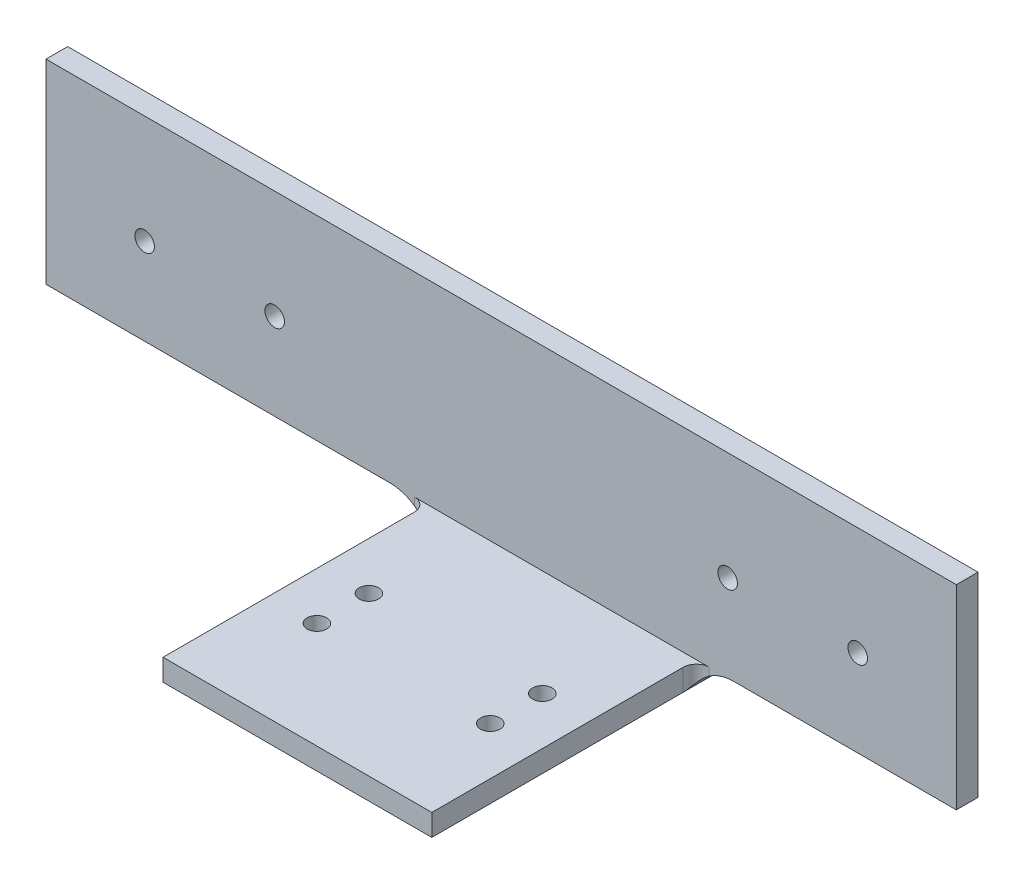
ISO-10303-21;
HEADER;
FILE_DESCRIPTION(('STEP AP214'),'2;1');
FILE_NAME('part.step','',(''),(''),'','','');
FILE_SCHEMA(('AUTOMOTIVE_DESIGN { 1 0 10303 214 1 1 1 1 }'));
ENDSEC;
DATA;
#1=APPLICATION_CONTEXT('core data for automotive mechanical design processes');
#2=APPLICATION_PROTOCOL_DEFINITION('international standard','automotive_design',2000,#1);
#3=PRODUCT_CONTEXT('',#1,'mechanical');
#4=PRODUCT('Part','Part','',(#3));
#5=PRODUCT_RELATED_PRODUCT_CATEGORY('part','',(#4));
#6=PRODUCT_DEFINITION_FORMATION('','',#4);
#7=PRODUCT_DEFINITION_CONTEXT('part definition',#1,'design');
#8=PRODUCT_DEFINITION('design','',#6,#7);
#9=PRODUCT_DEFINITION_SHAPE('','',#8);
#10=(LENGTH_UNIT() NAMED_UNIT(*) SI_UNIT(.MILLI.,.METRE.));
#11=(NAMED_UNIT(*) PLANE_ANGLE_UNIT() SI_UNIT($,.RADIAN.));
#12=(NAMED_UNIT(*) SI_UNIT($,.STERADIAN.) SOLID_ANGLE_UNIT());
#13=UNCERTAINTY_MEASURE_WITH_UNIT(LENGTH_MEASURE(1.E-05),#10,'distance_accuracy_value','');
#14=(GEOMETRIC_REPRESENTATION_CONTEXT(3) GLOBAL_UNCERTAINTY_ASSIGNED_CONTEXT((#13)) GLOBAL_UNIT_ASSIGNED_CONTEXT((#10,
#11,#12)) REPRESENTATION_CONTEXT('',''));
#15=CARTESIAN_POINT('',(0.,0.,0.));
#16=DIRECTION('',(0.,0.,1.));
#17=DIRECTION('',(1.,0.,0.));
#18=AXIS2_PLACEMENT_3D('',#15,#16,#17);
#19=CARTESIAN_POINT('',(0.,0.,0.));
#20=DIRECTION('',(0.,0.,-1.));
#21=DIRECTION('',(-1.,0.,0.));
#22=AXIS2_PLACEMENT_3D('',#19,#20,#21);
#23=PLANE('',#22);
#24=CARTESIAN_POINT('',(52.75,25.0000000000001,0.));
#25=DIRECTION('',(0.,0.,-1.));
#26=DIRECTION('',(-1.,0.,0.));
#27=AXIS2_PLACEMENT_3D('',#24,#25,#26);
#28=CIRCLE('',#27,2.25000000000001);
#29=CARTESIAN_POINT('',(50.4999999999999,25.0000000000001,0.));
#30=VERTEX_POINT('',#29);
#31=EDGE_CURVE('E275',#30,#30,#28,.T.);
#32=ORIENTED_EDGE('',*,*,#31,.F.);
#33=EDGE_LOOP('',(#32));
#34=FACE_BOUND('',#33,.T.);
#35=CARTESIAN_POINT('',(157.25,25.,0.));
#36=DIRECTION('',(0.,0.,1.));
#37=DIRECTION('',(1.,0.,0.));
#38=AXIS2_PLACEMENT_3D('',#35,#36,#37);
#39=CIRCLE('',#38,2.25000000000001);
#40=CARTESIAN_POINT('',(159.5,25.,0.));
#41=VERTEX_POINT('',#40);
#42=EDGE_CURVE('E281',#41,#41,#39,.T.);
#43=ORIENTED_EDGE('',*,*,#42,.T.);
#44=EDGE_LOOP('',(#43));
#45=FACE_BOUND('',#44,.T.);
#46=CARTESIAN_POINT('',(187.25,25.,0.));
#47=DIRECTION('',(0.,0.,1.));
#48=DIRECTION('',(1.,0.,0.));
#49=AXIS2_PLACEMENT_3D('',#46,#47,#48);
#50=CIRCLE('',#49,2.25000000000001);
#51=CARTESIAN_POINT('',(189.5,25.,0.));
#52=VERTEX_POINT('',#51);
#53=EDGE_CURVE('E262',#52,#52,#50,.T.);
#54=ORIENTED_EDGE('',*,*,#53,.T.);
#55=EDGE_LOOP('',(#54));
#56=FACE_BOUND('',#55,.T.);
#57=CARTESIAN_POINT('',(22.75,25.0000000000002,0.));
#58=DIRECTION('',(0.,0.,-1.));
#59=DIRECTION('',(-1.,0.,0.));
#60=AXIS2_PLACEMENT_3D('',#57,#58,#59);
#61=CIRCLE('',#60,2.25000000000001);
#62=CARTESIAN_POINT('',(20.5,25.0000000000002,0.));
#63=VERTEX_POINT('',#62);
#64=EDGE_CURVE('E265',#63,#63,#61,.T.);
#65=ORIENTED_EDGE('',*,*,#64,.F.);
#66=EDGE_LOOP('',(#65));
#67=FACE_BOUND('',#66,.T.);
#68=DIRECTION('',(1.,0.,0.));
#69=VECTOR('',#68,1.);
#70=CARTESIAN_POINT('',(0.,0.,0.));
#71=LINE('',#70,#69);
#72=CARTESIAN_POINT('',(88.,0.,0.));
#73=VERTEX_POINT('',#72);
#74=CARTESIAN_POINT('',(150.,0.,0.));
#75=VERTEX_POINT('',#74);
#76=EDGE_CURVE('E219',#73,#75,#71,.T.);
#77=ORIENTED_EDGE('',*,*,#76,.F.);
#78=CARTESIAN_POINT('',(79.3397459621556,-5.00000000000002,0.));
#79=DIRECTION('',(0.,0.,-1.));
#80=DIRECTION('',(-1.,0.,0.));
#81=AXIS2_PLACEMENT_3D('',#78,#79,#80);
#82=CIRCLE('',#81,10.);
#83=CARTESIAN_POINT('',(79.3397459621556,4.99999999999998,0.));
#84=VERTEX_POINT('',#83);
#85=EDGE_CURVE('E123',#73,#84,#82,.F.);
#86=ORIENTED_EDGE('',*,*,#85,.T.);
#87=DIRECTION('',(-1.,0.,0.));
#88=VECTOR('',#87,1.);
#89=CARTESIAN_POINT('',(0.,4.99999999999997,0.));
#90=LINE('',#89,#88);
#91=CARTESIAN_POINT('',(0.,4.99999999999997,0.));
#92=VERTEX_POINT('',#91);
#93=EDGE_CURVE('E216',#84,#92,#90,.T.);
#94=ORIENTED_EDGE('',*,*,#93,.T.);
#95=DIRECTION('',(0.,-1.,0.));
#96=VECTOR('',#95,1.);
#97=CARTESIAN_POINT('',(0.,0.,0.));
#98=LINE('',#97,#96);
#99=CARTESIAN_POINT('',(0.,50.,0.));
#100=VERTEX_POINT('',#99);
#101=EDGE_CURVE('E268',#100,#92,#98,.T.);
#102=ORIENTED_EDGE('',*,*,#101,.F.);
#103=DIRECTION('',(-1.,0.,0.));
#104=VECTOR('',#103,1.);
#105=CARTESIAN_POINT('',(0.,50.,0.));
#106=LINE('',#105,#104);
#107=CARTESIAN_POINT('',(210.,50.,0.));
#108=VERTEX_POINT('',#107);
#109=EDGE_CURVE('E292',#108,#100,#106,.T.);
#110=ORIENTED_EDGE('',*,*,#109,.F.);
#111=DIRECTION('',(0.,1.,0.));
#112=VECTOR('',#111,1.);
#113=CARTESIAN_POINT('',(210.,0.,0.));
#114=LINE('',#113,#112);
#115=CARTESIAN_POINT('',(210.,5.,0.));
#116=VERTEX_POINT('',#115);
#117=EDGE_CURVE('E301',#116,#108,#114,.T.);
#118=ORIENTED_EDGE('',*,*,#117,.F.);
#119=DIRECTION('',(-1.,0.,0.));
#120=VECTOR('',#119,1.);
#121=CARTESIAN_POINT('',(210.,5.,0.));
#122=LINE('',#121,#120);
#123=CARTESIAN_POINT('',(158.660254037844,4.99999999999999,0.));
#124=VERTEX_POINT('',#123);
#125=EDGE_CURVE('E110',#116,#124,#122,.T.);
#126=ORIENTED_EDGE('',*,*,#125,.T.);
#127=CARTESIAN_POINT('',(158.660254037844,-5.00000000000001,0.));
#128=DIRECTION('',(0.,0.,-1.));
#129=DIRECTION('',(-1.,0.,0.));
#130=AXIS2_PLACEMENT_3D('',#127,#128,#129);
#131=CIRCLE('',#130,10.);
#132=EDGE_CURVE('E192',#124,#75,#131,.F.);
#133=ORIENTED_EDGE('',*,*,#132,.T.);
#134=EDGE_LOOP('',(#77,#86,#94,#102,#110,#118,#126,#133));
#135=FACE_BOUND('',#134,.T.);
#136=ADVANCED_FACE('F37',(#34,#45,#56,#67,#135),#23,.T.);
#137=CARTESIAN_POINT('',(0.,0.,5.));
#138=DIRECTION('',(0.,1.,0.));
#139=DIRECTION('',(0.,0.,1.));
#140=AXIS2_PLACEMENT_3D('',#137,#138,#139);
#141=PLANE('',#140);
#142=CARTESIAN_POINT('',(138.991167508963,0.,29.5));
#143=DIRECTION('',(0.,1.,0.));
#144=DIRECTION('',(0.,0.,1.));
#145=AXIS2_PLACEMENT_3D('',#142,#143,#144);
#146=CIRCLE('',#145,2.25000000000001);
#147=CARTESIAN_POINT('',(138.991167508963,0.,31.75));
#148=VERTEX_POINT('',#147);
#149=EDGE_CURVE('E343',#148,#148,#146,.T.);
#150=ORIENTED_EDGE('',*,*,#149,.T.);
#151=EDGE_LOOP('',(#150));
#152=FACE_BOUND('',#151,.T.);
#153=CARTESIAN_POINT('',(98.9911675089627,0.,41.5));
#154=DIRECTION('',(0.,1.,0.));
#155=DIRECTION('',(0.,0.,1.));
#156=AXIS2_PLACEMENT_3D('',#153,#154,#155);
#157=CIRCLE('',#156,2.25);
#158=CARTESIAN_POINT('',(98.9911675089627,0.,43.75));
#159=VERTEX_POINT('',#158);
#160=EDGE_CURVE('E345',#159,#159,#157,.T.);
#161=ORIENTED_EDGE('',*,*,#160,.T.);
#162=EDGE_LOOP('',(#161));
#163=FACE_BOUND('',#162,.T.);
#164=CARTESIAN_POINT('',(138.991167508963,0.,41.5));
#165=DIRECTION('',(0.,1.,0.));
#166=DIRECTION('',(0.,0.,1.));
#167=AXIS2_PLACEMENT_3D('',#164,#165,#166);
#168=CIRCLE('',#167,2.25000000000001);
#169=CARTESIAN_POINT('',(138.991167508963,0.,43.75));
#170=VERTEX_POINT('',#169);
#171=EDGE_CURVE('E348',#170,#170,#168,.T.);
#172=ORIENTED_EDGE('',*,*,#171,.T.);
#173=EDGE_LOOP('',(#172));
#174=FACE_BOUND('',#173,.T.);
#175=CARTESIAN_POINT('',(98.9911675089627,0.,29.5));
#176=DIRECTION('',(0.,1.,0.));
#177=DIRECTION('',(0.,0.,1.));
#178=AXIS2_PLACEMENT_3D('',#175,#176,#177);
#179=CIRCLE('',#178,2.25);
#180=CARTESIAN_POINT('',(98.9911675089627,0.,31.75));
#181=VERTEX_POINT('',#180);
#182=EDGE_CURVE('E353',#181,#181,#179,.T.);
#183=ORIENTED_EDGE('',*,*,#182,.T.);
#184=EDGE_LOOP('',(#183));
#185=FACE_BOUND('',#184,.T.);
#186=DIRECTION('',(0.,0.,1.));
#187=VECTOR('',#186,1.);
#188=CARTESIAN_POINT('',(88.,0.,-0.001000000000001));
#189=LINE('',#188,#187);
#190=CARTESIAN_POINT('',(88.,0.,8.));
#191=VERTEX_POINT('',#190);
#192=EDGE_CURVE('E80',#73,#191,#189,.T.);
#193=ORIENTED_EDGE('',*,*,#192,.F.);
#194=ORIENTED_EDGE('',*,*,#76,.T.);
#195=DIRECTION('',(0.,0.,1.));
#196=VECTOR('',#195,1.);
#197=CARTESIAN_POINT('',(150.,0.,-0.001000000000001));
#198=LINE('',#197,#196);
#199=CARTESIAN_POINT('',(150.,0.,8.));
#200=VERTEX_POINT('',#199);
#201=EDGE_CURVE('E58',#75,#200,#198,.T.);
#202=ORIENTED_EDGE('',*,*,#201,.T.);
#203=CARTESIAN_POINT('',(150.,0.,66.));
#204=VERTEX_POINT('',#203);
#205=EDGE_CURVE('E254',#200,#204,#198,.T.);
#206=ORIENTED_EDGE('',*,*,#205,.T.);
#207=DIRECTION('',(1.,0.,0.));
#208=VECTOR('',#207,1.);
#209=CARTESIAN_POINT('',(210.,0.,66.));
#210=LINE('',#209,#208);
#211=CARTESIAN_POINT('',(88.,0.,66.));
#212=VERTEX_POINT('',#211);
#213=EDGE_CURVE('E240',#212,#204,#210,.T.);
#214=ORIENTED_EDGE('',*,*,#213,.F.);
#215=EDGE_CURVE('E235',#191,#212,#189,.T.);
#216=ORIENTED_EDGE('',*,*,#215,.F.);
#217=EDGE_LOOP('',(#193,#194,#202,#206,#214,#216));
#218=FACE_BOUND('',#217,.T.);
#219=ADVANCED_FACE('F148',(#152,#163,#174,#185,#218),#141,.F.);
#220=CARTESIAN_POINT('',(210.,5.,66.));
#221=DIRECTION('',(0.,-1.,0.));
#222=DIRECTION('',(1.,0.,0.));
#223=AXIS2_PLACEMENT_3D('',#220,#221,#222);
#224=PLANE('',#223);
#225=CARTESIAN_POINT('',(138.991167508963,4.99999999999999,29.5));
#226=DIRECTION('',(0.,1.,0.));
#227=DIRECTION('',(-1.,0.,0.));
#228=AXIS2_PLACEMENT_3D('',#225,#226,#227);
#229=CIRCLE('',#228,2.25000000000001);
#230=CARTESIAN_POINT('',(136.741167508963,4.99999999999999,29.5));
#231=VERTEX_POINT('',#230);
#232=EDGE_CURVE('E359',#231,#231,#229,.T.);
#233=ORIENTED_EDGE('',*,*,#232,.F.);
#234=EDGE_LOOP('',(#233));
#235=FACE_BOUND('',#234,.T.);
#236=CARTESIAN_POINT('',(98.9911675089627,4.99999999999998,41.5));
#237=DIRECTION('',(0.,1.,0.));
#238=DIRECTION('',(-1.,0.,0.));
#239=AXIS2_PLACEMENT_3D('',#236,#237,#238);
#240=CIRCLE('',#239,2.25);
#241=CARTESIAN_POINT('',(96.7411675089627,4.99999999999998,41.5));
#242=VERTEX_POINT('',#241);
#243=EDGE_CURVE('E360',#242,#242,#240,.T.);
#244=ORIENTED_EDGE('',*,*,#243,.F.);
#245=EDGE_LOOP('',(#244));
#246=FACE_BOUND('',#245,.T.);
#247=CARTESIAN_POINT('',(138.991167508963,4.99999999999999,41.5));
#248=DIRECTION('',(0.,1.,0.));
#249=DIRECTION('',(-1.,0.,0.));
#250=AXIS2_PLACEMENT_3D('',#247,#248,#249);
#251=CIRCLE('',#250,2.25000000000001);
#252=CARTESIAN_POINT('',(136.741167508963,4.99999999999999,41.5));
#253=VERTEX_POINT('',#252);
#254=EDGE_CURVE('E363',#253,#253,#251,.T.);
#255=ORIENTED_EDGE('',*,*,#254,.F.);
#256=EDGE_LOOP('',(#255));
#257=FACE_BOUND('',#256,.T.);
#258=CARTESIAN_POINT('',(98.9911675089627,4.99999999999998,29.5));
#259=DIRECTION('',(0.,1.,0.));
#260=DIRECTION('',(-1.,0.,0.));
#261=AXIS2_PLACEMENT_3D('',#258,#259,#260);
#262=CIRCLE('',#261,2.25);
#263=CARTESIAN_POINT('',(96.7411675089627,4.99999999999998,29.5));
#264=VERTEX_POINT('',#263);
#265=EDGE_CURVE('E356',#264,#264,#262,.T.);
#266=ORIENTED_EDGE('',*,*,#265,.F.);
#267=EDGE_LOOP('',(#266));
#268=FACE_BOUND('',#267,.T.);
#269=DIRECTION('',(-1.,0.,0.));
#270=VECTOR('',#269,1.);
#271=CARTESIAN_POINT('',(210.,5.,5.));
#272=LINE('',#271,#270);
#273=CARTESIAN_POINT('',(153.,4.99999999999999,5.));
#274=VERTEX_POINT('',#273);
#275=CARTESIAN_POINT('',(85.,4.99999999999998,5.));
#276=VERTEX_POINT('',#275);
#277=EDGE_CURVE('E101',#274,#276,#272,.T.);
#278=ORIENTED_EDGE('',*,*,#277,.T.);
#279=CARTESIAN_POINT('',(85.,4.99999999999998,8.));
#280=DIRECTION('',(0.,-1.,0.));
#281=DIRECTION('',(1.,0.,0.));
#282=AXIS2_PLACEMENT_3D('',#279,#280,#281);
#283=CIRCLE('',#282,3.);
#284=CARTESIAN_POINT('',(88.,4.99999999999998,8.));
#285=VERTEX_POINT('',#284);
#286=EDGE_CURVE('E90',#276,#285,#283,.T.);
#287=ORIENTED_EDGE('',*,*,#286,.T.);
#288=DIRECTION('',(0.,0.,1.));
#289=VECTOR('',#288,1.);
#290=CARTESIAN_POINT('',(88.,4.99999999999998,-0.001000000000001));
#291=LINE('',#290,#289);
#292=CARTESIAN_POINT('',(88.,4.99999999999998,66.));
#293=VERTEX_POINT('',#292);
#294=EDGE_CURVE('E237',#285,#293,#291,.T.);
#295=ORIENTED_EDGE('',*,*,#294,.T.);
#296=DIRECTION('',(-1.,0.,0.));
#297=VECTOR('',#296,1.);
#298=CARTESIAN_POINT('',(210.,5.,66.));
#299=LINE('',#298,#297);
#300=CARTESIAN_POINT('',(150.,4.99999999999999,66.));
#301=VERTEX_POINT('',#300);
#302=EDGE_CURVE('E259',#301,#293,#299,.T.);
#303=ORIENTED_EDGE('',*,*,#302,.F.);
#304=DIRECTION('',(0.,0.,1.));
#305=VECTOR('',#304,1.);
#306=CARTESIAN_POINT('',(150.,4.99999999999999,-0.001000000000001));
#307=LINE('',#306,#305);
#308=CARTESIAN_POINT('',(150.,4.99999999999999,8.));
#309=VERTEX_POINT('',#308);
#310=EDGE_CURVE('E116',#309,#301,#307,.T.);
#311=ORIENTED_EDGE('',*,*,#310,.F.);
#312=CARTESIAN_POINT('',(153.,4.99999999999999,8.));
#313=DIRECTION('',(0.,-1.,0.));
#314=DIRECTION('',(1.,0.,0.));
#315=AXIS2_PLACEMENT_3D('',#312,#313,#314);
#316=CIRCLE('',#315,3.);
#317=EDGE_CURVE('E51',#309,#274,#316,.T.);
#318=ORIENTED_EDGE('',*,*,#317,.T.);
#319=EDGE_LOOP('',(#278,#287,#295,#303,#311,#318));
#320=FACE_BOUND('',#319,.T.);
#321=ADVANCED_FACE('F113',(#235,#246,#257,#268,#320),#224,.F.);
#322=CARTESIAN_POINT('',(0.,0.,66.));
#323=DIRECTION('',(0.,0.,1.));
#324=DIRECTION('',(1.,0.,0.));
#325=AXIS2_PLACEMENT_3D('',#322,#323,#324);
#326=PLANE('',#325);
#327=ORIENTED_EDGE('',*,*,#302,.T.);
#328=DIRECTION('',(0.,-1.,0.));
#329=VECTOR('',#328,1.);
#330=CARTESIAN_POINT('',(88.,0.,66.));
#331=LINE('',#330,#329);
#332=EDGE_CURVE('E244',#293,#212,#331,.T.);
#333=ORIENTED_EDGE('',*,*,#332,.T.);
#334=ORIENTED_EDGE('',*,*,#213,.T.);
#335=DIRECTION('',(0.,-1.,0.));
#336=VECTOR('',#335,1.);
#337=CARTESIAN_POINT('',(150.,4.99999999999999,66.));
#338=LINE('',#337,#336);
#339=EDGE_CURVE('E249',#301,#204,#338,.T.);
#340=ORIENTED_EDGE('',*,*,#339,.F.);
#341=EDGE_LOOP('',(#327,#333,#334,#340));
#342=FACE_BOUND('',#341,.T.);
#343=ADVANCED_FACE('F341',(#342),#326,.T.);
#344=CARTESIAN_POINT('',(0.,0.,5.));
#345=DIRECTION('',(0.,0.,-1.));
#346=DIRECTION('',(-1.,0.,0.));
#347=AXIS2_PLACEMENT_3D('',#344,#345,#346);
#348=PLANE('',#347);
#349=CARTESIAN_POINT('',(22.75,25.0000000000002,5.));
#350=DIRECTION('',(0.,0.,-1.));
#351=DIRECTION('',(-1.,0.,0.));
#352=AXIS2_PLACEMENT_3D('',#349,#350,#351);
#353=CIRCLE('',#352,2.25000000000001);
#354=CARTESIAN_POINT('',(20.5,25.0000000000002,5.));
#355=VERTEX_POINT('',#354);
#356=EDGE_CURVE('E269',#355,#355,#353,.T.);
#357=ORIENTED_EDGE('',*,*,#356,.T.);
#358=EDGE_LOOP('',(#357));
#359=FACE_BOUND('',#358,.T.);
#360=CARTESIAN_POINT('',(52.75,25.0000000000001,5.));
#361=DIRECTION('',(0.,0.,-1.));
#362=DIRECTION('',(-1.,0.,0.));
#363=AXIS2_PLACEMENT_3D('',#360,#361,#362);
#364=CIRCLE('',#363,2.25000000000001);
#365=CARTESIAN_POINT('',(50.4999999999999,25.0000000000001,5.));
#366=VERTEX_POINT('',#365);
#367=EDGE_CURVE('E272',#366,#366,#364,.T.);
#368=ORIENTED_EDGE('',*,*,#367,.T.);
#369=EDGE_LOOP('',(#368));
#370=FACE_BOUND('',#369,.T.);
#371=CARTESIAN_POINT('',(187.25,25.,5.));
#372=DIRECTION('',(0.,0.,1.));
#373=DIRECTION('',(1.,0.,0.));
#374=AXIS2_PLACEMENT_3D('',#371,#372,#373);
#375=CIRCLE('',#374,2.25000000000001);
#376=CARTESIAN_POINT('',(189.5,25.,5.));
#377=VERTEX_POINT('',#376);
#378=EDGE_CURVE('E284',#377,#377,#375,.T.);
#379=ORIENTED_EDGE('',*,*,#378,.F.);
#380=EDGE_LOOP('',(#379));
#381=FACE_BOUND('',#380,.T.);
#382=CARTESIAN_POINT('',(157.25,25.,5.));
#383=DIRECTION('',(0.,0.,1.));
#384=DIRECTION('',(1.,0.,0.));
#385=AXIS2_PLACEMENT_3D('',#382,#383,#384);
#386=CIRCLE('',#385,2.25000000000001);
#387=CARTESIAN_POINT('',(159.5,25.,5.));
#388=VERTEX_POINT('',#387);
#389=EDGE_CURVE('E278',#388,#388,#386,.T.);
#390=ORIENTED_EDGE('',*,*,#389,.F.);
#391=EDGE_LOOP('',(#390));
#392=FACE_BOUND('',#391,.T.);
#393=CARTESIAN_POINT('',(79.3397459621556,-5.00000000000002,5.));
#394=DIRECTION('',(0.,0.,-1.));
#395=DIRECTION('',(-1.,0.,0.));
#396=AXIS2_PLACEMENT_3D('',#393,#394,#395);
#397=CIRCLE('',#396,10.);
#398=CARTESIAN_POINT('',(79.3397459621556,4.99999999999998,5.));
#399=VERTEX_POINT('',#398);
#400=CARTESIAN_POINT('',(85.,3.24387798472698,5.));
#401=VERTEX_POINT('',#400);
#402=EDGE_CURVE('E206',#399,#401,#397,.T.);
#403=ORIENTED_EDGE('',*,*,#402,.T.);
#404=DIRECTION('',(0.,-1.,0.));
#405=VECTOR('',#404,1.);
#406=CARTESIAN_POINT('',(85.,0.,5.));
#407=LINE('',#406,#405);
#408=EDGE_CURVE('E108',#401,#276,#407,.F.);
#409=ORIENTED_EDGE('',*,*,#408,.T.);
#410=ORIENTED_EDGE('',*,*,#277,.F.);
#411=DIRECTION('',(0.,1.,0.));
#412=VECTOR('',#411,1.);
#413=CARTESIAN_POINT('',(153.,0.,5.));
#414=LINE('',#413,#412);
#415=CARTESIAN_POINT('',(153.,3.24387798472699,5.));
#416=VERTEX_POINT('',#415);
#417=EDGE_CURVE('E105',#274,#416,#414,.F.);
#418=ORIENTED_EDGE('',*,*,#417,.T.);
#419=CARTESIAN_POINT('',(158.660254037844,-5.00000000000001,5.));
#420=DIRECTION('',(0.,0.,-1.));
#421=DIRECTION('',(-1.,0.,0.));
#422=AXIS2_PLACEMENT_3D('',#419,#420,#421);
#423=CIRCLE('',#422,10.);
#424=CARTESIAN_POINT('',(158.660254037844,4.99999999999999,5.));
#425=VERTEX_POINT('',#424);
#426=EDGE_CURVE('E203',#416,#425,#423,.T.);
#427=ORIENTED_EDGE('',*,*,#426,.T.);
#428=CARTESIAN_POINT('',(210.,5.,5.));
#429=VERTEX_POINT('',#428);
#430=EDGE_CURVE('E109',#429,#425,#272,.T.);
#431=ORIENTED_EDGE('',*,*,#430,.F.);
#432=DIRECTION('',(0.,1.,0.));
#433=VECTOR('',#432,1.);
#434=CARTESIAN_POINT('',(210.,0.,5.));
#435=LINE('',#434,#433);
#436=CARTESIAN_POINT('',(210.,50.,5.));
#437=VERTEX_POINT('',#436);
#438=EDGE_CURVE('E291',#429,#437,#435,.T.);
#439=ORIENTED_EDGE('',*,*,#438,.T.);
#440=DIRECTION('',(-1.,0.,0.));
#441=VECTOR('',#440,1.);
#442=CARTESIAN_POINT('',(0.,50.,5.));
#443=LINE('',#442,#441);
#444=CARTESIAN_POINT('',(0.,50.,5.));
#445=VERTEX_POINT('',#444);
#446=EDGE_CURVE('E295',#437,#445,#443,.T.);
#447=ORIENTED_EDGE('',*,*,#446,.T.);
#448=DIRECTION('',(0.,-1.,0.));
#449=VECTOR('',#448,1.);
#450=CARTESIAN_POINT('',(0.,0.,5.));
#451=LINE('',#450,#449);
#452=CARTESIAN_POINT('',(0.,4.99999999999997,5.));
#453=VERTEX_POINT('',#452);
#454=EDGE_CURVE('E289',#445,#453,#451,.T.);
#455=ORIENTED_EDGE('',*,*,#454,.T.);
#456=DIRECTION('',(1.,0.,0.));
#457=VECTOR('',#456,1.);
#458=CARTESIAN_POINT('',(0.,4.99999999999997,5.));
#459=LINE('',#458,#457);
#460=EDGE_CURVE('E227',#453,#399,#459,.T.);
#461=ORIENTED_EDGE('',*,*,#460,.T.);
#462=EDGE_LOOP('',(#403,#409,#410,#418,#427,#431,#439,#447,#455,#461));
#463=FACE_BOUND('',#462,.T.);
#464=ADVANCED_FACE('F103',(#359,#370,#381,#392,#463),#348,.F.);
#465=CARTESIAN_POINT('',(0.,0.,5.));
#466=DIRECTION('',(1.,0.,0.));
#467=DIRECTION('',(0.,0.,-1.));
#468=AXIS2_PLACEMENT_3D('',#465,#466,#467);
#469=PLANE('',#468);
#470=ORIENTED_EDGE('',*,*,#101,.T.);
#471=DIRECTION('',(0.,0.,1.));
#472=VECTOR('',#471,1.);
#473=CARTESIAN_POINT('',(0.,4.99999999999997,-0.001000000000001));
#474=LINE('',#473,#472);
#475=EDGE_CURVE('E225',#92,#453,#474,.T.);
#476=ORIENTED_EDGE('',*,*,#475,.T.);
#477=ORIENTED_EDGE('',*,*,#454,.F.);
#478=DIRECTION('',(0.,0.,-1.));
#479=VECTOR('',#478,1.);
#480=CARTESIAN_POINT('',(0.,50.,5.));
#481=LINE('',#480,#479);
#482=EDGE_CURVE('E298',#445,#100,#481,.T.);
#483=ORIENTED_EDGE('',*,*,#482,.T.);
#484=EDGE_LOOP('',(#470,#476,#477,#483));
#485=FACE_BOUND('',#484,.T.);
#486=ADVANCED_FACE('F168',(#485),#469,.F.);
#487=CARTESIAN_POINT('',(210.,0.,5.));
#488=DIRECTION('',(-1.,0.,0.));
#489=DIRECTION('',(0.,0.,1.));
#490=AXIS2_PLACEMENT_3D('',#487,#488,#489);
#491=PLANE('',#490);
#492=ORIENTED_EDGE('',*,*,#438,.F.);
#493=DIRECTION('',(0.,0.,1.));
#494=VECTOR('',#493,1.);
#495=CARTESIAN_POINT('',(210.,5.,-0.001000000000001));
#496=LINE('',#495,#494);
#497=EDGE_CURVE('E252',#116,#429,#496,.T.);
#498=ORIENTED_EDGE('',*,*,#497,.F.);
#499=ORIENTED_EDGE('',*,*,#117,.T.);
#500=DIRECTION('',(0.,0.,-1.));
#501=VECTOR('',#500,1.);
#502=CARTESIAN_POINT('',(210.,50.,5.));
#503=LINE('',#502,#501);
#504=EDGE_CURVE('E308',#437,#108,#503,.T.);
#505=ORIENTED_EDGE('',*,*,#504,.F.);
#506=EDGE_LOOP('',(#492,#498,#499,#505));
#507=FACE_BOUND('',#506,.T.);
#508=ADVANCED_FACE('F165',(#507),#491,.F.);
#509=CARTESIAN_POINT('',(0.,50.,5.));
#510=DIRECTION('',(0.,-1.,0.));
#511=DIRECTION('',(0.,0.,-1.));
#512=AXIS2_PLACEMENT_3D('',#509,#510,#511);
#513=PLANE('',#512);
#514=ORIENTED_EDGE('',*,*,#109,.T.);
#515=ORIENTED_EDGE('',*,*,#482,.F.);
#516=ORIENTED_EDGE('',*,*,#446,.F.);
#517=ORIENTED_EDGE('',*,*,#504,.T.);
#518=EDGE_LOOP('',(#514,#515,#516,#517));
#519=FACE_BOUND('',#518,.T.);
#520=ADVANCED_FACE('F161',(#519),#513,.F.);
#521=CARTESIAN_POINT('',(187.25,25.,0.));
#522=DIRECTION('',(0.,0.,1.));
#523=DIRECTION('',(1.,0.,0.));
#524=AXIS2_PLACEMENT_3D('',#521,#522,#523);
#525=CYLINDRICAL_SURFACE('',#524,2.25000000000001);
#526=ORIENTED_EDGE('',*,*,#53,.F.);
#527=EDGE_LOOP('',(#526));
#528=FACE_BOUND('',#527,.T.);
#529=ORIENTED_EDGE('',*,*,#378,.T.);
#530=EDGE_LOOP('',(#529));
#531=FACE_BOUND('',#530,.T.);
#532=ADVANCED_FACE('F164',(#528,#531),#525,.F.);
#533=CARTESIAN_POINT('',(157.25,25.,0.));
#534=DIRECTION('',(0.,0.,1.));
#535=DIRECTION('',(1.,0.,0.));
#536=AXIS2_PLACEMENT_3D('',#533,#534,#535);
#537=CYLINDRICAL_SURFACE('',#536,2.25000000000001);
#538=ORIENTED_EDGE('',*,*,#42,.F.);
#539=EDGE_LOOP('',(#538));
#540=FACE_BOUND('',#539,.T.);
#541=ORIENTED_EDGE('',*,*,#389,.T.);
#542=EDGE_LOOP('',(#541));
#543=FACE_BOUND('',#542,.T.);
#544=ADVANCED_FACE('F404',(#540,#543),#537,.F.);
#545=CARTESIAN_POINT('',(52.75,25.0000000000001,0.));
#546=DIRECTION('',(0.,0.,1.));
#547=DIRECTION('',(1.,0.,0.));
#548=AXIS2_PLACEMENT_3D('',#545,#546,#547);
#549=CYLINDRICAL_SURFACE('',#548,2.25000000000001);
#550=ORIENTED_EDGE('',*,*,#31,.T.);
#551=EDGE_LOOP('',(#550));
#552=FACE_BOUND('',#551,.T.);
#553=ORIENTED_EDGE('',*,*,#367,.F.);
#554=EDGE_LOOP('',(#553));
#555=FACE_BOUND('',#554,.T.);
#556=ADVANCED_FACE('F400',(#552,#555),#549,.F.);
#557=CARTESIAN_POINT('',(22.75,25.0000000000002,0.));
#558=DIRECTION('',(0.,0.,1.));
#559=DIRECTION('',(1.,0.,0.));
#560=AXIS2_PLACEMENT_3D('',#557,#558,#559);
#561=CYLINDRICAL_SURFACE('',#560,2.25000000000001);
#562=ORIENTED_EDGE('',*,*,#64,.T.);
#563=EDGE_LOOP('',(#562));
#564=FACE_BOUND('',#563,.T.);
#565=ORIENTED_EDGE('',*,*,#356,.F.);
#566=EDGE_LOOP('',(#565));
#567=FACE_BOUND('',#566,.T.);
#568=ADVANCED_FACE('F395',(#564,#567),#561,.F.);
#569=CARTESIAN_POINT('',(210.,5.,-0.001000000000001));
#570=DIRECTION('',(0.,1.,0.));
#571=DIRECTION('',(-1.,0.,0.));
#572=AXIS2_PLACEMENT_3D('',#569,#570,#571);
#573=PLANE('',#572);
#574=ORIENTED_EDGE('',*,*,#430,.T.);
#575=DIRECTION('',(0.,0.,-1.));
#576=VECTOR('',#575,1.);
#577=CARTESIAN_POINT('',(158.660254037844,4.99999999999999,-0.001000000000001));
#578=LINE('',#577,#576);
#579=EDGE_CURVE('E195',#425,#124,#578,.T.);
#580=ORIENTED_EDGE('',*,*,#579,.T.);
#581=ORIENTED_EDGE('',*,*,#125,.F.);
#582=ORIENTED_EDGE('',*,*,#497,.T.);
#583=EDGE_LOOP('',(#574,#580,#581,#582));
#584=FACE_BOUND('',#583,.T.);
#585=ADVANCED_FACE('F185',(#584),#573,.F.);
#586=CARTESIAN_POINT('',(150.,4.99999999999999,-0.001000000000001));
#587=DIRECTION('',(-1.,0.,0.));
#588=DIRECTION('',(0.,0.,1.));
#589=AXIS2_PLACEMENT_3D('',#586,#587,#588);
#590=PLANE('',#589);
#591=ORIENTED_EDGE('',*,*,#205,.F.);
#592=DIRECTION('',(0.,1.,0.));
#593=VECTOR('',#592,1.);
#594=CARTESIAN_POINT('',(150.,4.99999999999999,8.));
#595=LINE('',#594,#593);
#596=EDGE_CURVE('E120',#200,#309,#595,.T.);
#597=ORIENTED_EDGE('',*,*,#596,.T.);
#598=ORIENTED_EDGE('',*,*,#310,.T.);
#599=ORIENTED_EDGE('',*,*,#339,.T.);
#600=EDGE_LOOP('',(#591,#597,#598,#599));
#601=FACE_BOUND('',#600,.T.);
#602=ADVANCED_FACE('F177',(#601),#590,.F.);
#603=CARTESIAN_POINT('',(158.660254037844,-5.00000000000001,-0.001000000000001));
#604=DIRECTION('',(0.,0.,-1.));
#605=DIRECTION('',(-1.,0.,0.));
#606=AXIS2_PLACEMENT_3D('',#603,#604,#605);
#607=CYLINDRICAL_SURFACE('',#606,10.);
#608=ORIENTED_EDGE('',*,*,#132,.F.);
#609=ORIENTED_EDGE('',*,*,#579,.F.);
#610=ORIENTED_EDGE('',*,*,#426,.F.);
#611=CARTESIAN_POINT('',(153.,3.24387798472699,5.));
#612=CARTESIAN_POINT('',(152.89450654204,3.17147039878085,5.00001010468199));
#613=CARTESIAN_POINT('',(152.79048993206,3.09705003535376,5.00556225901506));
#614=CARTESIAN_POINT('',(152.586156301319,2.94490011264807,5.02690641835065));
#615=CARTESIAN_POINT('',(152.485835261564,2.8671743589714,5.04268693020765));
#616=CARTESIAN_POINT('',(152.289842767995,2.70932201263585,5.08355482521388));
#617=CARTESIAN_POINT('',(152.194152361001,2.62920784866985,5.10859985260425));
#618=CARTESIAN_POINT('',(152.007330438713,2.46685706328787,5.16729883061893));
#619=CARTESIAN_POINT('',(151.916200278537,2.38461982185741,5.20095532226383));
#620=CARTESIAN_POINT('',(151.649832050014,2.13533265607844,5.31404971900582));
#621=CARTESIAN_POINT('',(151.481774300713,1.96583560094358,5.40557783561004));
#622=CARTESIAN_POINT('',(151.245449420519,1.71075697749187,5.56471912857703));
#623=CARTESIAN_POINT('',(151.169207145768,1.62547366850688,5.62150125867283));
#624=CARTESIAN_POINT('',(151.022124500194,1.45535277981802,5.74233164222288));
#625=CARTESIAN_POINT('',(150.95128334993,1.37051513745127,5.80637884391886));
#626=CARTESIAN_POINT('',(150.827357188959,1.21720583670466,5.92977118963108));
#627=CARTESIAN_POINT('',(150.7733563764,1.14850951096443,5.9879233980362));
#628=CARTESIAN_POINT('',(150.669334511316,1.01269607689613,6.10939372257166));
#629=CARTESIAN_POINT('',(150.619312720284,0.945578677155115,6.1727108756472));
#630=CARTESIAN_POINT('',(150.52358291343,0.813879461452583,6.30471376110198));
#631=CARTESIAN_POINT('',(150.477866822975,0.749293037533306,6.37338898427191));
#632=CARTESIAN_POINT('',(150.391049197327,0.623706516467442,6.51663075801609));
#633=CARTESIAN_POINT('',(150.349945022408,0.562704377403535,6.59119389644476));
#634=CARTESIAN_POINT('',(150.26697893499,0.436858701040782,6.75877323613904));
#635=CARTESIAN_POINT('',(150.225969343533,0.372863016047643,6.85286505975036));
#636=CARTESIAN_POINT('',(150.152271348168,0.255381236843369,7.05051328668263));
#637=CARTESIAN_POINT('',(150.119573431101,0.201883143721594,7.15405868362156));
#638=CARTESIAN_POINT('',(150.07063092247,0.120559346695375,7.34698610209088));
#639=CARTESIAN_POINT('',(150.052353948844,0.0896800480523505,7.43454196904885));
#640=CARTESIAN_POINT('',(150.02352098679,0.0406026585474918,7.61427844234021));
#641=CARTESIAN_POINT('',(150.012941448037,0.0223658959569966,7.70644401251855));
#642=CARTESIAN_POINT('',(150.004473308124,0.0077412984765075,7.83285136698541));
#643=CARTESIAN_POINT('',(150.002799354543,0.00484601345212397,7.86617846699243));
#644=CARTESIAN_POINT('',(150.000562410141,0.000974474796073134,7.93299854660728));
#645=CARTESIAN_POINT('',(150.000000008011,-7.61952095634179E-07,7.96649160470068));
#646=CARTESIAN_POINT('',(150.,0.,8.00000000000001));
#647=B_SPLINE_CURVE_WITH_KNOTS('',3,(#611,#612,#613,#614,#615,#616,#617,#618,#619,#620,#621,
#622,#623,#624,#625,#626,#627,#628,#629,#630,#631,#632,#633,#634,#635,#636,#637,#638,#639,#640,
#641,#642,#643,#644,#645,#646),.UNSPECIFIED.,.F.,.F.,(4,2,2,2,2,2,2,2,2,2,2,2,2,2,2,2,2,4),(0.,
0.383597068815493,0.766763852337453,1.14820008856317,1.52974900682909,2.29346038303928,
2.67637431123564,3.05923287588431,3.3739292835455,3.68856714650524,4.0026026920684,
4.31645756585545,4.67849252088238,5.04011122251158,5.3229802259647,5.60498010928136,
5.70540351576452,5.8058800935482),.UNSPECIFIED.);
#648=EDGE_CURVE('E11',#416,#200,#647,.T.);
#649=ORIENTED_EDGE('',*,*,#648,.T.);
#650=ORIENTED_EDGE('',*,*,#201,.F.);
#651=EDGE_LOOP('',(#608,#609,#610,#649,#650));
#652=FACE_BOUND('',#651,.T.);
#653=ADVANCED_FACE('F173',(#652),#607,.F.);
#654=CARTESIAN_POINT('',(0.,4.99999999999997,-0.001000000000001));
#655=DIRECTION('',(0.,1.,0.));
#656=DIRECTION('',(-1.,0.,0.));
#657=AXIS2_PLACEMENT_3D('',#654,#655,#656);
#658=PLANE('',#657);
#659=ORIENTED_EDGE('',*,*,#93,.F.);
#660=DIRECTION('',(0.,0.,-1.));
#661=VECTOR('',#660,1.);
#662=CARTESIAN_POINT('',(79.3397459621556,4.99999999999998,-0.001000000000001));
#663=LINE('',#662,#661);
#664=EDGE_CURVE('E202',#84,#399,#663,.F.);
#665=ORIENTED_EDGE('',*,*,#664,.T.);
#666=ORIENTED_EDGE('',*,*,#460,.F.);
#667=ORIENTED_EDGE('',*,*,#475,.F.);
#668=EDGE_LOOP('',(#659,#665,#666,#667));
#669=FACE_BOUND('',#668,.T.);
#670=ADVANCED_FACE('F176',(#669),#658,.F.);
#671=CARTESIAN_POINT('',(88.,0.,-0.001000000000001));
#672=DIRECTION('',(-1.,0.,0.));
#673=DIRECTION('',(0.,0.,1.));
#674=AXIS2_PLACEMENT_3D('',#671,#672,#673);
#675=PLANE('',#674);
#676=ORIENTED_EDGE('',*,*,#294,.F.);
#677=DIRECTION('',(0.,-1.,0.));
#678=VECTOR('',#677,1.);
#679=CARTESIAN_POINT('',(88.,0.,8.));
#680=LINE('',#679,#678);
#681=EDGE_CURVE('E118',#285,#191,#680,.T.);
#682=ORIENTED_EDGE('',*,*,#681,.T.);
#683=ORIENTED_EDGE('',*,*,#215,.T.);
#684=ORIENTED_EDGE('',*,*,#332,.F.);
#685=EDGE_LOOP('',(#676,#682,#683,#684));
#686=FACE_BOUND('',#685,.T.);
#687=ADVANCED_FACE('F146',(#686),#675,.T.);
#688=CARTESIAN_POINT('',(79.3397459621556,-5.00000000000002,-0.001000000000001));
#689=DIRECTION('',(0.,0.,-1.));
#690=DIRECTION('',(-1.,0.,0.));
#691=AXIS2_PLACEMENT_3D('',#688,#689,#690);
#692=CYLINDRICAL_SURFACE('',#691,10.);
#693=ORIENTED_EDGE('',*,*,#85,.F.);
#694=ORIENTED_EDGE('',*,*,#192,.T.);
#695=CARTESIAN_POINT('',(88.,0.,8.));
#696=CARTESIAN_POINT('',(88.0000099858034,-2.30365147960673E-05,7.95307201625242));
#697=CARTESIAN_POINT('',(87.9988992436159,0.00190648830440388,7.90615874247067));
#698=CARTESIAN_POINT('',(87.9945151652941,0.00949142682599255,7.81280073893986));
#699=CARTESIAN_POINT('',(87.9912448875934,0.0151415711838322,7.76635544073063));
#700=CARTESIAN_POINT('',(87.9826766514889,0.0298922486351522,7.67484074732085));
#701=CARTESIAN_POINT('',(87.977405798979,0.0389466425539984,7.62976129962158));
#702=CARTESIAN_POINT('',(87.9649616280742,0.0602181440597931,7.54061868812883));
#703=CARTESIAN_POINT('',(87.9577875351814,0.0724365391459352,7.49655594602247));
#704=CARTESIAN_POINT('',(87.9286887662008,0.121695782459005,7.33964234953278));
#705=CARTESIAN_POINT('',(87.9016138007704,0.167025681365282,7.23027678001177));
#706=CARTESIAN_POINT('',(87.8378374618541,0.271259005475541,7.02080909976958));
#707=CARTESIAN_POINT('',(87.8010773924759,0.330244918180253,6.92076868700417));
#708=CARTESIAN_POINT('',(87.726447534847,0.446764124609252,6.745402331609));
#709=CARTESIAN_POINT('',(87.6897187426542,0.502989475753659,6.66869603587084));
#710=CARTESIAN_POINT('',(87.6115406214563,0.619818047108263,6.52120624858891));
#711=CARTESIAN_POINT('',(87.5700881127032,0.680424206083097,6.45042680294478));
#712=CARTESIAN_POINT('',(87.4828934628281,0.804733026942503,6.31424057048243));
#713=CARTESIAN_POINT('',(87.4371447591888,0.868440352010503,6.2488422990423));
#714=CARTESIAN_POINT('',(87.3417138547848,0.997915120469399,6.12314028789091));
#715=CARTESIAN_POINT('',(87.292030582973,1.06368312184164,6.06283794466408));
#716=CARTESIAN_POINT('',(87.1649686793965,1.22744289474588,5.92014034725853));
#717=CARTESIAN_POINT('',(87.0854541174155,1.32619858567099,5.84051011493611));
#718=CARTESIAN_POINT('',(86.9188449630176,1.52488252273231,5.691202866448));
#719=CARTESIAN_POINT('',(86.8317472234022,1.62481124067367,5.62153001482376));
#720=CARTESIAN_POINT('',(86.6504576946036,1.82434070668703,5.49234176604137));
#721=CARTESIAN_POINT('',(86.5562809840166,1.92394170523318,5.43280561407957));
#722=CARTESIAN_POINT('',(86.3609477451969,2.12194205751377,5.32412500402295));
#723=CARTESIAN_POINT('',(86.2597926726298,2.22034165684634,5.27497838734303));
#724=CARTESIAN_POINT('',(86.0676338632274,2.39931655459289,5.19479392376244));
#725=CARTESIAN_POINT('',(85.9776130150362,2.48021390707887,5.16211498464779));
#726=CARTESIAN_POINT('',(85.793190097674,2.63989096583768,5.10514951287314));
#727=CARTESIAN_POINT('',(85.6987897320396,2.71867147699414,5.0808597475447));
#728=CARTESIAN_POINT('',(85.5056875602657,2.87378636219215,5.04128056320342));
#729=CARTESIAN_POINT('',(85.4069743381014,2.95011318349474,5.02601680725836));
#730=CARTESIAN_POINT('',(85.2059843290273,3.09957129216374,5.00537517432383));
#731=CARTESIAN_POINT('',(85.1037034854467,3.17269871355516,5.00000895149528));
#732=CARTESIAN_POINT('',(85.,3.24387798472698,5.));
#733=B_SPLINE_CURVE_WITH_KNOTS('',3,(#695,#696,#697,#698,#699,#700,#701,#702,#703,#704,#705,
#706,#707,#708,#709,#710,#711,#712,#713,#714,#715,#716,#717,#718,#719,#720,#721,#722,#723,#724,
#725,#726,#727,#728,#729,#730,#731,#732),.UNSPECIFIED.,.F.,.F.,(4,2,2,2,2,2,2,2,2,2,2,2,2,2,2,2,
2,2,4),(0.,0.140707434417078,0.281216018642021,0.419885132897124,0.5586107634701,
0.920720926041599,1.28507823440458,1.59050794966636,1.89614449175276,2.20225573834733,
2.5084506012372,2.95702023100074,3.4057769234095,3.85360344288507,4.30133682789893,
4.67708082409087,5.05267986983477,5.4293417603143,5.80644688070796),.UNSPECIFIED.);
#734=EDGE_CURVE('E128',#191,#401,#733,.T.);
#735=ORIENTED_EDGE('',*,*,#734,.T.);
#736=ORIENTED_EDGE('',*,*,#402,.F.);
#737=ORIENTED_EDGE('',*,*,#664,.F.);
#738=EDGE_LOOP('',(#693,#694,#735,#736,#737));
#739=FACE_BOUND('',#738,.T.);
#740=ADVANCED_FACE('F135',(#739),#692,.F.);
#741=CARTESIAN_POINT('',(85.,0.,8.));
#742=DIRECTION('',(0.,-1.,0.));
#743=DIRECTION('',(0.,0.,-1.));
#744=AXIS2_PLACEMENT_3D('',#741,#742,#743);
#745=CYLINDRICAL_SURFACE('',#744,3.);
#746=ORIENTED_EDGE('',*,*,#286,.F.);
#747=ORIENTED_EDGE('',*,*,#408,.F.);
#748=ORIENTED_EDGE('',*,*,#734,.F.);
#749=ORIENTED_EDGE('',*,*,#681,.F.);
#750=EDGE_LOOP('',(#746,#747,#748,#749));
#751=FACE_BOUND('',#750,.T.);
#752=ADVANCED_FACE('F137',(#751),#745,.F.);
#753=CARTESIAN_POINT('',(153.,4.99999999999999,8.));
#754=DIRECTION('',(0.,-1.,0.));
#755=DIRECTION('',(0.,0.,-1.));
#756=AXIS2_PLACEMENT_3D('',#753,#754,#755);
#757=CYLINDRICAL_SURFACE('',#756,3.);
#758=ORIENTED_EDGE('',*,*,#648,.F.);
#759=ORIENTED_EDGE('',*,*,#417,.F.);
#760=ORIENTED_EDGE('',*,*,#317,.F.);
#761=ORIENTED_EDGE('',*,*,#596,.F.);
#762=EDGE_LOOP('',(#758,#759,#760,#761));
#763=FACE_BOUND('',#762,.T.);
#764=ADVANCED_FACE('F39',(#763),#757,.F.);
#765=CARTESIAN_POINT('',(98.9911675089627,-0.301262183920614,29.5));
#766=DIRECTION('',(0.,1.,0.));
#767=DIRECTION('',(-1.,0.,0.));
#768=AXIS2_PLACEMENT_3D('',#765,#766,#767);
#769=CYLINDRICAL_SURFACE('',#768,2.25);
#770=ORIENTED_EDGE('',*,*,#265,.T.);
#771=EDGE_LOOP('',(#770));
#772=FACE_BOUND('',#771,.T.);
#773=ORIENTED_EDGE('',*,*,#182,.F.);
#774=EDGE_LOOP('',(#773));
#775=FACE_BOUND('',#774,.T.);
#776=ADVANCED_FACE('F145',(#772,#775),#769,.F.);
#777=CARTESIAN_POINT('',(138.991167508963,-0.301262183920609,41.5));
#778=DIRECTION('',(0.,1.,0.));
#779=DIRECTION('',(-1.,0.,0.));
#780=AXIS2_PLACEMENT_3D('',#777,#778,#779);
#781=CYLINDRICAL_SURFACE('',#780,2.25000000000001);
#782=ORIENTED_EDGE('',*,*,#254,.T.);
#783=EDGE_LOOP('',(#782));
#784=FACE_BOUND('',#783,.T.);
#785=ORIENTED_EDGE('',*,*,#171,.F.);
#786=EDGE_LOOP('',(#785));
#787=FACE_BOUND('',#786,.T.);
#788=ADVANCED_FACE('F369',(#784,#787),#781,.F.);
#789=CARTESIAN_POINT('',(98.9911675089627,-0.301262183920614,41.5));
#790=DIRECTION('',(0.,1.,0.));
#791=DIRECTION('',(-1.,0.,0.));
#792=AXIS2_PLACEMENT_3D('',#789,#790,#791);
#793=CYLINDRICAL_SURFACE('',#792,2.25);
#794=ORIENTED_EDGE('',*,*,#243,.T.);
#795=EDGE_LOOP('',(#794));
#796=FACE_BOUND('',#795,.T.);
#797=ORIENTED_EDGE('',*,*,#160,.F.);
#798=EDGE_LOOP('',(#797));
#799=FACE_BOUND('',#798,.T.);
#800=ADVANCED_FACE('F386',(#796,#799),#793,.F.);
#801=CARTESIAN_POINT('',(138.991167508963,-0.301262183920609,29.5));
#802=DIRECTION('',(0.,1.,0.));
#803=DIRECTION('',(-1.,0.,0.));
#804=AXIS2_PLACEMENT_3D('',#801,#802,#803);
#805=CYLINDRICAL_SURFACE('',#804,2.25000000000001);
#806=ORIENTED_EDGE('',*,*,#232,.T.);
#807=EDGE_LOOP('',(#806));
#808=FACE_BOUND('',#807,.T.);
#809=ORIENTED_EDGE('',*,*,#149,.F.);
#810=EDGE_LOOP('',(#809));
#811=FACE_BOUND('',#810,.T.);
#812=ADVANCED_FACE('F537',(#808,#811),#805,.F.);
#813=CLOSED_SHELL('',(#136,#219,#321,#343,#464,#486,#508,#520,#532,#544,#556,#568,#585,#602,
#653,#670,#687,#740,#752,#764,#776,#788,#800,#812));
#814=MANIFOLD_SOLID_BREP('B2',#813);
#815=ADVANCED_BREP_SHAPE_REPRESENTATION('',(#18,#814),#14);
#816=SHAPE_DEFINITION_REPRESENTATION(#9,#815);
ENDSEC;
END-ISO-10303-21;
